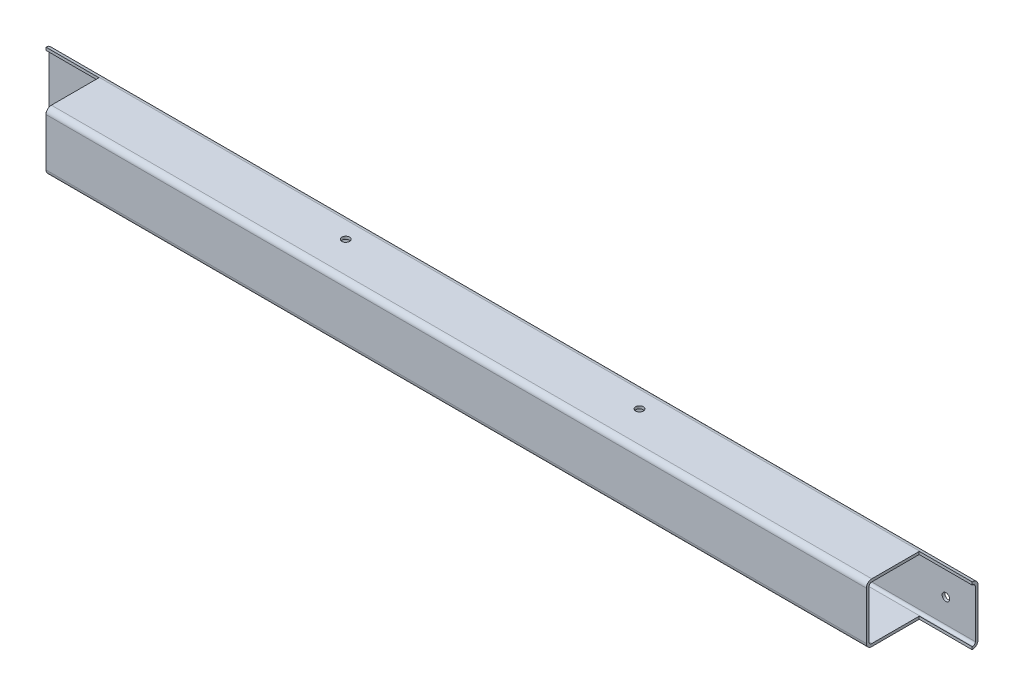
ISO-10303-21;
HEADER;
FILE_DESCRIPTION(('STEP AP214'),'2;1');
FILE_NAME('part.step','',(''),(''),'','','');
FILE_SCHEMA(('AUTOMOTIVE_DESIGN { 1 0 10303 214 1 1 1 1 }'));
ENDSEC;
DATA;
#1=APPLICATION_CONTEXT('core data for automotive mechanical design processes');
#2=APPLICATION_PROTOCOL_DEFINITION('international standard','automotive_design',2000,#1);
#3=PRODUCT_CONTEXT('',#1,'mechanical');
#4=PRODUCT('Part','Part','',(#3));
#5=PRODUCT_RELATED_PRODUCT_CATEGORY('part','',(#4));
#6=PRODUCT_DEFINITION_FORMATION('','',#4);
#7=PRODUCT_DEFINITION_CONTEXT('part definition',#1,'design');
#8=PRODUCT_DEFINITION('design','',#6,#7);
#9=PRODUCT_DEFINITION_SHAPE('','',#8);
#10=(LENGTH_UNIT() NAMED_UNIT(*) SI_UNIT(.MILLI.,.METRE.));
#11=(NAMED_UNIT(*) PLANE_ANGLE_UNIT() SI_UNIT($,.RADIAN.));
#12=(NAMED_UNIT(*) SI_UNIT($,.STERADIAN.) SOLID_ANGLE_UNIT());
#13=UNCERTAINTY_MEASURE_WITH_UNIT(LENGTH_MEASURE(1.E-05),#10,'distance_accuracy_value','');
#14=(GEOMETRIC_REPRESENTATION_CONTEXT(3) GLOBAL_UNCERTAINTY_ASSIGNED_CONTEXT((#13)) GLOBAL_UNIT_ASSIGNED_CONTEXT((#10,
#11,#12)) REPRESENTATION_CONTEXT('',''));
#15=CARTESIAN_POINT('',(0.,0.,0.));
#16=DIRECTION('',(0.,0.,1.));
#17=DIRECTION('',(1.,0.,0.));
#18=AXIS2_PLACEMENT_3D('',#15,#16,#17);
#19=CARTESIAN_POINT('',(394.,-20.3999999999999,20.4));
#20=DIRECTION('',(-1.,0.,0.));
#21=DIRECTION('',(0.,-1.,0.));
#22=AXIS2_PLACEMENT_3D('',#19,#20,#21);
#23=CYLINDRICAL_SURFACE('',#22,2.3);
#24=CARTESIAN_POINT('',(-349.,-20.4,20.4));
#25=DIRECTION('',(1.,0.,0.));
#26=DIRECTION('',(0.,0.,-1.));
#27=AXIS2_PLACEMENT_3D('',#24,#25,#26);
#28=CIRCLE('',#27,2.3);
#29=CARTESIAN_POINT('',(-349.,-20.3999999999999,22.7));
#30=VERTEX_POINT('',#29);
#31=CARTESIAN_POINT('',(-349.,-22.7,20.4));
#32=VERTEX_POINT('',#31);
#33=EDGE_CURVE('E333',#30,#32,#28,.T.);
#34=ORIENTED_EDGE('',*,*,#33,.F.);
#35=DIRECTION('',(-1.,0.,0.));
#36=VECTOR('',#35,1.);
#37=CARTESIAN_POINT('',(394.,-20.3999999999999,22.7));
#38=LINE('',#37,#36);
#39=CARTESIAN_POINT('',(349.,-20.3999999999999,22.7));
#40=VERTEX_POINT('',#39);
#41=EDGE_CURVE('E446',#40,#30,#38,.T.);
#42=ORIENTED_EDGE('',*,*,#41,.F.);
#43=CARTESIAN_POINT('',(349.,-20.3999999999999,20.4));
#44=DIRECTION('',(-1.,0.,0.));
#45=DIRECTION('',(0.,0.,1.));
#46=AXIS2_PLACEMENT_3D('',#43,#44,#45);
#47=CIRCLE('',#46,2.3);
#48=CARTESIAN_POINT('',(349.,-22.6999999999999,20.4));
#49=VERTEX_POINT('',#48);
#50=EDGE_CURVE('E313',#49,#40,#47,.T.);
#51=ORIENTED_EDGE('',*,*,#50,.F.);
#52=DIRECTION('',(-1.,0.,0.));
#53=VECTOR('',#52,1.);
#54=CARTESIAN_POINT('',(394.,-22.6999999999999,20.4));
#55=LINE('',#54,#53);
#56=EDGE_CURVE('E420',#49,#32,#55,.T.);
#57=ORIENTED_EDGE('',*,*,#56,.T.);
#58=EDGE_LOOP('',(#34,#42,#51,#57));
#59=FACE_BOUND('',#58,.T.);
#60=ADVANCED_FACE('F65',(#59),#23,.F.);
#61=CARTESIAN_POINT('',(394.,-20.3999999999999,22.7));
#62=DIRECTION('',(0.,0.,-1.));
#63=DIRECTION('',(-1.,0.,0.));
#64=AXIS2_PLACEMENT_3D('',#61,#62,#63);
#65=PLANE('',#64);
#66=DIRECTION('',(0.,-1.,0.));
#67=VECTOR('',#66,1.);
#68=CARTESIAN_POINT('',(-349.,-20.3999999999999,22.7));
#69=LINE('',#68,#67);
#70=CARTESIAN_POINT('',(-349.,20.4000000000001,22.7));
#71=VERTEX_POINT('',#70);
#72=EDGE_CURVE('E336',#71,#30,#69,.T.);
#73=ORIENTED_EDGE('',*,*,#72,.F.);
#74=DIRECTION('',(-1.,0.,0.));
#75=VECTOR('',#74,1.);
#76=CARTESIAN_POINT('',(394.,20.4000000000001,22.7));
#77=LINE('',#76,#75);
#78=CARTESIAN_POINT('',(349.,20.4000000000001,22.7));
#79=VERTEX_POINT('',#78);
#80=EDGE_CURVE('E442',#79,#71,#77,.T.);
#81=ORIENTED_EDGE('',*,*,#80,.F.);
#82=DIRECTION('',(0.,1.,0.));
#83=VECTOR('',#82,1.);
#84=CARTESIAN_POINT('',(349.,-20.3999999999999,22.7));
#85=LINE('',#84,#83);
#86=EDGE_CURVE('E316',#40,#79,#85,.T.);
#87=ORIENTED_EDGE('',*,*,#86,.F.);
#88=ORIENTED_EDGE('',*,*,#41,.T.);
#89=EDGE_LOOP('',(#73,#81,#87,#88));
#90=FACE_BOUND('',#89,.T.);
#91=ADVANCED_FACE('F573',(#90),#65,.T.);
#92=CARTESIAN_POINT('',(394.,20.4000000000001,20.4));
#93=DIRECTION('',(-1.,0.,0.));
#94=DIRECTION('',(0.,-1.,0.));
#95=AXIS2_PLACEMENT_3D('',#92,#93,#94);
#96=CYLINDRICAL_SURFACE('',#95,2.3);
#97=CARTESIAN_POINT('',(-349.,20.4,20.4));
#98=DIRECTION('',(1.,0.,0.));
#99=DIRECTION('',(0.,0.,-1.));
#100=AXIS2_PLACEMENT_3D('',#97,#98,#99);
#101=CIRCLE('',#100,2.3);
#102=CARTESIAN_POINT('',(-349.,22.7,20.4));
#103=VERTEX_POINT('',#102);
#104=EDGE_CURVE('E339',#103,#71,#101,.T.);
#105=ORIENTED_EDGE('',*,*,#104,.F.);
#106=DIRECTION('',(-1.,0.,0.));
#107=VECTOR('',#106,1.);
#108=CARTESIAN_POINT('',(394.,22.7000000000001,20.4));
#109=LINE('',#108,#107);
#110=CARTESIAN_POINT('',(349.,22.7000000000001,20.4));
#111=VERTEX_POINT('',#110);
#112=EDGE_CURVE('E438',#111,#103,#109,.T.);
#113=ORIENTED_EDGE('',*,*,#112,.F.);
#114=CARTESIAN_POINT('',(349.,20.4000000000001,20.4));
#115=DIRECTION('',(-1.,0.,0.));
#116=DIRECTION('',(0.,0.,1.));
#117=AXIS2_PLACEMENT_3D('',#114,#115,#116);
#118=CIRCLE('',#117,2.3);
#119=EDGE_CURVE('E319',#79,#111,#118,.T.);
#120=ORIENTED_EDGE('',*,*,#119,.F.);
#121=ORIENTED_EDGE('',*,*,#80,.T.);
#122=EDGE_LOOP('',(#105,#113,#120,#121));
#123=FACE_BOUND('',#122,.T.);
#124=ADVANCED_FACE('F568',(#123),#96,.F.);
#125=CARTESIAN_POINT('',(394.,22.7000000000001,-20.4));
#126=DIRECTION('',(0.,-1.,0.));
#127=DIRECTION('',(1.,0.,0.));
#128=AXIS2_PLACEMENT_3D('',#125,#126,#127);
#129=PLANE('',#128);
#130=CARTESIAN_POINT('',(125.,22.7000000000001,-5.99999999999998));
#131=DIRECTION('',(0.,-1.,0.));
#132=DIRECTION('',(1.,0.,0.));
#133=AXIS2_PLACEMENT_3D('',#130,#131,#132);
#134=CIRCLE('',#133,3.25000000000001);
#135=CARTESIAN_POINT('',(128.25,22.7000000000001,-5.99999999999998));
#136=VERTEX_POINT('',#135);
#137=EDGE_CURVE('E515',#136,#136,#134,.T.);
#138=ORIENTED_EDGE('',*,*,#137,.F.);
#139=EDGE_LOOP('',(#138));
#140=FACE_BOUND('',#139,.T.);
#141=CARTESIAN_POINT('',(-125.,22.7000000000001,-5.99999999999998));
#142=DIRECTION('',(0.,-1.,0.));
#143=DIRECTION('',(1.,0.,0.));
#144=AXIS2_PLACEMENT_3D('',#141,#142,#143);
#145=CIRCLE('',#144,3.25000000000001);
#146=CARTESIAN_POINT('',(-121.75,22.7000000000001,-5.99999999999998));
#147=VERTEX_POINT('',#146);
#148=EDGE_CURVE('E508',#147,#147,#145,.T.);
#149=ORIENTED_EDGE('',*,*,#148,.F.);
#150=EDGE_LOOP('',(#149));
#151=FACE_BOUND('',#150,.T.);
#152=DIRECTION('',(1.,0.,0.));
#153=VECTOR('',#152,1.);
#154=CARTESIAN_POINT('',(394.,22.7000000000001,-20.));
#155=LINE('',#154,#153);
#156=CARTESIAN_POINT('',(-394.,22.7,-20.));
#157=VERTEX_POINT('',#156);
#158=CARTESIAN_POINT('',(-349.,22.7,-20.));
#159=VERTEX_POINT('',#158);
#160=EDGE_CURVE('E235',#157,#159,#155,.T.);
#161=ORIENTED_EDGE('',*,*,#160,.F.);
#162=DIRECTION('',(0.,0.,1.));
#163=VECTOR('',#162,1.);
#164=CARTESIAN_POINT('',(-394.,22.7,-20.4));
#165=LINE('',#164,#163);
#166=CARTESIAN_POINT('',(-394.,22.7,-20.4));
#167=VERTEX_POINT('',#166);
#168=EDGE_CURVE('E402',#167,#157,#165,.T.);
#169=ORIENTED_EDGE('',*,*,#168,.F.);
#170=DIRECTION('',(-1.,0.,0.));
#171=VECTOR('',#170,1.);
#172=CARTESIAN_POINT('',(394.,22.7000000000001,-20.4));
#173=LINE('',#172,#171);
#174=CARTESIAN_POINT('',(394.,22.7000000000001,-20.4));
#175=VERTEX_POINT('',#174);
#176=EDGE_CURVE('E435',#175,#167,#173,.T.);
#177=ORIENTED_EDGE('',*,*,#176,.F.);
#178=DIRECTION('',(0.,0.,1.));
#179=VECTOR('',#178,1.);
#180=CARTESIAN_POINT('',(394.,22.7000000000001,-20.4));
#181=LINE('',#180,#179);
#182=CARTESIAN_POINT('',(394.,22.7000000000001,-20.));
#183=VERTEX_POINT('',#182);
#184=EDGE_CURVE('E369',#175,#183,#181,.T.);
#185=ORIENTED_EDGE('',*,*,#184,.T.);
#186=DIRECTION('',(1.,0.,0.));
#187=VECTOR('',#186,1.);
#188=CARTESIAN_POINT('',(394.,22.7000000000001,-20.));
#189=LINE('',#188,#187);
#190=CARTESIAN_POINT('',(349.,22.7000000000001,-20.));
#191=VERTEX_POINT('',#190);
#192=EDGE_CURVE('E310',#191,#183,#189,.T.);
#193=ORIENTED_EDGE('',*,*,#192,.F.);
#194=DIRECTION('',(0.,0.,-1.));
#195=VECTOR('',#194,1.);
#196=CARTESIAN_POINT('',(349.,22.7000000000001,-20.4));
#197=LINE('',#196,#195);
#198=EDGE_CURVE('E322',#111,#191,#197,.T.);
#199=ORIENTED_EDGE('',*,*,#198,.F.);
#200=ORIENTED_EDGE('',*,*,#112,.T.);
#201=DIRECTION('',(0.,0.,1.));
#202=VECTOR('',#201,1.);
#203=CARTESIAN_POINT('',(-349.,22.7,-20.4));
#204=LINE('',#203,#202);
#205=EDGE_CURVE('E342',#159,#103,#204,.T.);
#206=ORIENTED_EDGE('',*,*,#205,.F.);
#207=EDGE_LOOP('',(#161,#169,#177,#185,#193,#199,#200,#206));
#208=FACE_BOUND('',#207,.T.);
#209=ADVANCED_FACE('F562',(#140,#151,#208),#129,.T.);
#210=CARTESIAN_POINT('',(394.,20.4000000000001,-20.4));
#211=DIRECTION('',(-1.,0.,0.));
#212=DIRECTION('',(0.,-1.,0.));
#213=AXIS2_PLACEMENT_3D('',#210,#211,#212);
#214=CYLINDRICAL_SURFACE('',#213,2.3);
#215=CARTESIAN_POINT('',(-394.,20.4,-20.4));
#216=DIRECTION('',(1.,0.,0.));
#217=DIRECTION('',(0.,1.,0.));
#218=AXIS2_PLACEMENT_3D('',#215,#216,#217);
#219=CIRCLE('',#218,2.3);
#220=CARTESIAN_POINT('',(-394.,20.4,-22.7));
#221=VERTEX_POINT('',#220);
#222=EDGE_CURVE('E406',#221,#167,#219,.T.);
#223=ORIENTED_EDGE('',*,*,#222,.F.);
#224=DIRECTION('',(-1.,0.,0.));
#225=VECTOR('',#224,1.);
#226=CARTESIAN_POINT('',(394.,20.4000000000001,-22.7));
#227=LINE('',#226,#225);
#228=CARTESIAN_POINT('',(394.,20.4000000000001,-22.7));
#229=VERTEX_POINT('',#228);
#230=EDGE_CURVE('E432',#229,#221,#227,.T.);
#231=ORIENTED_EDGE('',*,*,#230,.F.);
#232=CARTESIAN_POINT('',(394.,20.4000000000001,-20.4));
#233=DIRECTION('',(1.,0.,0.));
#234=DIRECTION('',(0.,1.,0.));
#235=AXIS2_PLACEMENT_3D('',#232,#233,#234);
#236=CIRCLE('',#235,2.3);
#237=EDGE_CURVE('E373',#229,#175,#236,.T.);
#238=ORIENTED_EDGE('',*,*,#237,.T.);
#239=ORIENTED_EDGE('',*,*,#176,.T.);
#240=EDGE_LOOP('',(#223,#231,#238,#239));
#241=FACE_BOUND('',#240,.T.);
#242=ADVANCED_FACE('F540',(#241),#214,.F.);
#243=CARTESIAN_POINT('',(394.,-20.3999999999999,-22.7));
#244=DIRECTION('',(0.,0.,1.));
#245=DIRECTION('',(1.,0.,0.));
#246=AXIS2_PLACEMENT_3D('',#243,#244,#245);
#247=PLANE('',#246);
#248=CARTESIAN_POINT('',(369.,0.,-22.7));
#249=DIRECTION('',(0.,0.,1.));
#250=DIRECTION('',(1.,0.,0.));
#251=AXIS2_PLACEMENT_3D('',#248,#249,#250);
#252=CIRCLE('',#251,3.24999999999995);
#253=CARTESIAN_POINT('',(372.25,0.,-22.7));
#254=VERTEX_POINT('',#253);
#255=EDGE_CURVE('E283',#254,#254,#252,.T.);
#256=ORIENTED_EDGE('',*,*,#255,.F.);
#257=EDGE_LOOP('',(#256));
#258=FACE_BOUND('',#257,.T.);
#259=CARTESIAN_POINT('',(-369.,1.35568400665612E-13,-22.7));
#260=DIRECTION('',(0.,0.,1.));
#261=DIRECTION('',(1.,0.,0.));
#262=AXIS2_PLACEMENT_3D('',#259,#260,#261);
#263=CIRCLE('',#262,3.24999999999995);
#264=CARTESIAN_POINT('',(-365.75,1.35568400665612E-13,-22.7));
#265=VERTEX_POINT('',#264);
#266=EDGE_CURVE('E524',#265,#265,#263,.T.);
#267=ORIENTED_EDGE('',*,*,#266,.F.);
#268=EDGE_LOOP('',(#267));
#269=FACE_BOUND('',#268,.T.);
#270=DIRECTION('',(0.,1.,0.));
#271=VECTOR('',#270,1.);
#272=CARTESIAN_POINT('',(-394.,-20.4,-22.7));
#273=LINE('',#272,#271);
#274=CARTESIAN_POINT('',(-394.,-20.4,-22.7));
#275=VERTEX_POINT('',#274);
#276=EDGE_CURVE('E410',#275,#221,#273,.T.);
#277=ORIENTED_EDGE('',*,*,#276,.F.);
#278=DIRECTION('',(-1.,0.,0.));
#279=VECTOR('',#278,1.);
#280=CARTESIAN_POINT('',(394.,-20.3999999999999,-22.7));
#281=LINE('',#280,#279);
#282=CARTESIAN_POINT('',(394.,-20.3999999999999,-22.7));
#283=VERTEX_POINT('',#282);
#284=EDGE_CURVE('E429',#283,#275,#281,.T.);
#285=ORIENTED_EDGE('',*,*,#284,.F.);
#286=DIRECTION('',(0.,1.,0.));
#287=VECTOR('',#286,1.);
#288=CARTESIAN_POINT('',(394.,-20.3999999999999,-22.7));
#289=LINE('',#288,#287);
#290=EDGE_CURVE('E377',#283,#229,#289,.T.);
#291=ORIENTED_EDGE('',*,*,#290,.T.);
#292=ORIENTED_EDGE('',*,*,#230,.T.);
#293=EDGE_LOOP('',(#277,#285,#291,#292));
#294=FACE_BOUND('',#293,.T.);
#295=ADVANCED_FACE('F536',(#258,#269,#294),#247,.T.);
#296=CARTESIAN_POINT('',(394.,-20.3999999999999,-20.4));
#297=DIRECTION('',(-1.,0.,0.));
#298=DIRECTION('',(0.,-1.,0.));
#299=AXIS2_PLACEMENT_3D('',#296,#297,#298);
#300=CYLINDRICAL_SURFACE('',#299,2.3);
#301=CARTESIAN_POINT('',(-394.,-20.4,-20.4));
#302=DIRECTION('',(1.,0.,0.));
#303=DIRECTION('',(0.,-1.,0.));
#304=AXIS2_PLACEMENT_3D('',#301,#302,#303);
#305=CIRCLE('',#304,2.3);
#306=CARTESIAN_POINT('',(-394.,-22.7,-20.4));
#307=VERTEX_POINT('',#306);
#308=EDGE_CURVE('E414',#307,#275,#305,.T.);
#309=ORIENTED_EDGE('',*,*,#308,.F.);
#310=DIRECTION('',(-1.,0.,0.));
#311=VECTOR('',#310,1.);
#312=CARTESIAN_POINT('',(394.,-22.6999999999999,-20.4));
#313=LINE('',#312,#311);
#314=CARTESIAN_POINT('',(394.,-22.6999999999999,-20.4));
#315=VERTEX_POINT('',#314);
#316=EDGE_CURVE('E424',#315,#307,#313,.T.);
#317=ORIENTED_EDGE('',*,*,#316,.F.);
#318=CARTESIAN_POINT('',(394.,-20.3999999999999,-20.4));
#319=DIRECTION('',(1.,0.,0.));
#320=DIRECTION('',(0.,-1.,0.));
#321=AXIS2_PLACEMENT_3D('',#318,#319,#320);
#322=CIRCLE('',#321,2.3);
#323=EDGE_CURVE('E381',#315,#283,#322,.T.);
#324=ORIENTED_EDGE('',*,*,#323,.T.);
#325=ORIENTED_EDGE('',*,*,#284,.T.);
#326=EDGE_LOOP('',(#309,#317,#324,#325));
#327=FACE_BOUND('',#326,.T.);
#328=ADVANCED_FACE('F539',(#327),#300,.F.);
#329=CARTESIAN_POINT('',(394.,-20.3999999999999,20.4));
#330=DIRECTION('',(-1.,0.,0.));
#331=DIRECTION('',(0.,-1.,0.));
#332=AXIS2_PLACEMENT_3D('',#329,#330,#331);
#333=CYLINDRICAL_SURFACE('',#332,4.6);
#334=DIRECTION('',(-1.,0.,0.));
#335=VECTOR('',#334,1.);
#336=CARTESIAN_POINT('',(394.,-20.3999999999999,25.));
#337=LINE('',#336,#335);
#338=CARTESIAN_POINT('',(349.,-20.4,25.));
#339=VERTEX_POINT('',#338);
#340=CARTESIAN_POINT('',(-349.,-20.4,25.));
#341=VERTEX_POINT('',#340);
#342=EDGE_CURVE('E388',#339,#341,#337,.T.);
#343=ORIENTED_EDGE('',*,*,#342,.T.);
#344=CARTESIAN_POINT('',(-349.,-20.4,20.4));
#345=DIRECTION('',(1.,0.,0.));
#346=DIRECTION('',(0.,0.,-1.));
#347=AXIS2_PLACEMENT_3D('',#344,#345,#346);
#348=CIRCLE('',#347,4.6);
#349=CARTESIAN_POINT('',(-349.,-25.,20.4));
#350=VERTEX_POINT('',#349);
#351=EDGE_CURVE('E347',#341,#350,#348,.T.);
#352=ORIENTED_EDGE('',*,*,#351,.T.);
#353=DIRECTION('',(-1.,0.,0.));
#354=VECTOR('',#353,1.);
#355=CARTESIAN_POINT('',(394.,-24.9999999999999,20.4));
#356=LINE('',#355,#354);
#357=CARTESIAN_POINT('',(349.,-25.,20.4));
#358=VERTEX_POINT('',#357);
#359=EDGE_CURVE('E425',#358,#350,#356,.T.);
#360=ORIENTED_EDGE('',*,*,#359,.F.);
#361=CARTESIAN_POINT('',(349.,-20.3999999999999,20.4));
#362=DIRECTION('',(-1.,0.,0.));
#363=DIRECTION('',(0.,0.,1.));
#364=AXIS2_PLACEMENT_3D('',#361,#362,#363);
#365=CIRCLE('',#364,4.6);
#366=EDGE_CURVE('E329',#358,#339,#365,.T.);
#367=ORIENTED_EDGE('',*,*,#366,.T.);
#368=EDGE_LOOP('',(#343,#352,#360,#367));
#369=FACE_BOUND('',#368,.T.);
#370=ADVANCED_FACE('F67',(#369),#333,.T.);
#371=CARTESIAN_POINT('',(394.,-24.9999999999999,-20.4));
#372=DIRECTION('',(0.,1.,0.));
#373=DIRECTION('',(-1.,0.,0.));
#374=AXIS2_PLACEMENT_3D('',#371,#372,#373);
#375=PLANE('',#374);
#376=CARTESIAN_POINT('',(-125.,-25.,-5.99999999999998));
#377=DIRECTION('',(0.,-1.,0.));
#378=DIRECTION('',(1.,0.,0.));
#379=AXIS2_PLACEMENT_3D('',#376,#377,#378);
#380=CIRCLE('',#379,7.50000000000001);
#381=CARTESIAN_POINT('',(-117.5,-25.,-5.99999999999998));
#382=VERTEX_POINT('',#381);
#383=EDGE_CURVE('E488',#382,#382,#380,.T.);
#384=ORIENTED_EDGE('',*,*,#383,.F.);
#385=EDGE_LOOP('',(#384));
#386=FACE_BOUND('',#385,.T.);
#387=CARTESIAN_POINT('',(125.,-24.9999999999999,-5.99999999999998));
#388=DIRECTION('',(0.,-1.,0.));
#389=DIRECTION('',(1.,0.,0.));
#390=AXIS2_PLACEMENT_3D('',#387,#388,#389);
#391=CIRCLE('',#390,7.50000000000001);
#392=CARTESIAN_POINT('',(132.5,-24.9999999999999,-5.99999999999998));
#393=VERTEX_POINT('',#392);
#394=EDGE_CURVE('E496',#393,#393,#391,.T.);
#395=ORIENTED_EDGE('',*,*,#394,.F.);
#396=EDGE_LOOP('',(#395));
#397=FACE_BOUND('',#396,.T.);
#398=DIRECTION('',(0.,0.,-1.));
#399=VECTOR('',#398,1.);
#400=CARTESIAN_POINT('',(-349.,-25.,25.));
#401=LINE('',#400,#399);
#402=CARTESIAN_POINT('',(-349.,-25.,-20.));
#403=VERTEX_POINT('',#402);
#404=EDGE_CURVE('E259',#350,#403,#401,.T.);
#405=ORIENTED_EDGE('',*,*,#404,.T.);
#406=DIRECTION('',(-1.,0.,0.));
#407=VECTOR('',#406,1.);
#408=CARTESIAN_POINT('',(-394.,-25.,-20.));
#409=LINE('',#408,#407);
#410=CARTESIAN_POINT('',(-394.,-25.,-20.));
#411=VERTEX_POINT('',#410);
#412=EDGE_CURVE('E265',#403,#411,#409,.T.);
#413=ORIENTED_EDGE('',*,*,#412,.T.);
#414=DIRECTION('',(0.,0.,-1.));
#415=VECTOR('',#414,1.);
#416=CARTESIAN_POINT('',(-394.,-25.,-20.4));
#417=LINE('',#416,#415);
#418=CARTESIAN_POINT('',(-394.,-25.,-20.4));
#419=VERTEX_POINT('',#418);
#420=EDGE_CURVE('E351',#411,#419,#417,.T.);
#421=ORIENTED_EDGE('',*,*,#420,.T.);
#422=DIRECTION('',(-1.,0.,0.));
#423=VECTOR('',#422,1.);
#424=CARTESIAN_POINT('',(394.,-24.9999999999999,-20.4));
#425=LINE('',#424,#423);
#426=CARTESIAN_POINT('',(394.,-24.9999999999999,-20.4));
#427=VERTEX_POINT('',#426);
#428=EDGE_CURVE('E472',#427,#419,#425,.T.);
#429=ORIENTED_EDGE('',*,*,#428,.F.);
#430=DIRECTION('',(0.,0.,-1.));
#431=VECTOR('',#430,1.);
#432=CARTESIAN_POINT('',(394.,-24.9999999999999,-20.4));
#433=LINE('',#432,#431);
#434=CARTESIAN_POINT('',(394.,-24.9999999999999,-20.));
#435=VERTEX_POINT('',#434);
#436=EDGE_CURVE('E352',#435,#427,#433,.T.);
#437=ORIENTED_EDGE('',*,*,#436,.F.);
#438=DIRECTION('',(-1.,0.,0.));
#439=VECTOR('',#438,1.);
#440=CARTESIAN_POINT('',(394.,-25.,-20.));
#441=LINE('',#440,#439);
#442=CARTESIAN_POINT('',(349.,-25.,-20.));
#443=VERTEX_POINT('',#442);
#444=EDGE_CURVE('E83',#435,#443,#441,.T.);
#445=ORIENTED_EDGE('',*,*,#444,.T.);
#446=DIRECTION('',(0.,0.,1.));
#447=VECTOR('',#446,1.);
#448=CARTESIAN_POINT('',(349.,-25.,25.));
#449=LINE('',#448,#447);
#450=EDGE_CURVE('E288',#443,#358,#449,.T.);
#451=ORIENTED_EDGE('',*,*,#450,.T.);
#452=ORIENTED_EDGE('',*,*,#359,.T.);
#453=EDGE_LOOP('',(#405,#413,#421,#429,#437,#445,#451,#452));
#454=FACE_BOUND('',#453,.T.);
#455=ADVANCED_FACE('F588',(#386,#397,#454),#375,.F.);
#456=CARTESIAN_POINT('',(394.,-20.3999999999999,-20.4));
#457=DIRECTION('',(-1.,0.,0.));
#458=DIRECTION('',(0.,-1.,0.));
#459=AXIS2_PLACEMENT_3D('',#456,#457,#458);
#460=CYLINDRICAL_SURFACE('',#459,4.6);
#461=CARTESIAN_POINT('',(-394.,-20.4,-20.4));
#462=DIRECTION('',(1.,0.,0.));
#463=DIRECTION('',(0.,-1.,0.));
#464=AXIS2_PLACEMENT_3D('',#461,#462,#463);
#465=CIRCLE('',#464,4.6);
#466=CARTESIAN_POINT('',(-394.,-20.4,-25.));
#467=VERTEX_POINT('',#466);
#468=EDGE_CURVE('E391',#419,#467,#465,.T.);
#469=ORIENTED_EDGE('',*,*,#468,.T.);
#470=DIRECTION('',(-1.,0.,0.));
#471=VECTOR('',#470,1.);
#472=CARTESIAN_POINT('',(394.,-20.3999999999999,-25.));
#473=LINE('',#472,#471);
#474=CARTESIAN_POINT('',(394.,-20.3999999999999,-25.));
#475=VERTEX_POINT('',#474);
#476=EDGE_CURVE('E468',#475,#467,#473,.T.);
#477=ORIENTED_EDGE('',*,*,#476,.F.);
#478=CARTESIAN_POINT('',(394.,-20.3999999999999,-20.4));
#479=DIRECTION('',(1.,0.,0.));
#480=DIRECTION('',(0.,-1.,0.));
#481=AXIS2_PLACEMENT_3D('',#478,#479,#480);
#482=CIRCLE('',#481,4.6);
#483=EDGE_CURVE('E355',#427,#475,#482,.T.);
#484=ORIENTED_EDGE('',*,*,#483,.F.);
#485=ORIENTED_EDGE('',*,*,#428,.T.);
#486=EDGE_LOOP('',(#469,#477,#484,#485));
#487=FACE_BOUND('',#486,.T.);
#488=ADVANCED_FACE('F623',(#487),#460,.T.);
#489=CARTESIAN_POINT('',(394.,-20.3999999999999,-25.));
#490=DIRECTION('',(0.,0.,1.));
#491=DIRECTION('',(1.,0.,0.));
#492=AXIS2_PLACEMENT_3D('',#489,#490,#491);
#493=PLANE('',#492);
#494=CARTESIAN_POINT('',(369.,0.,-25.));
#495=DIRECTION('',(0.,0.,-1.));
#496=DIRECTION('',(-1.,0.,0.));
#497=AXIS2_PLACEMENT_3D('',#494,#495,#496);
#498=CIRCLE('',#497,3.24999999999995);
#499=CARTESIAN_POINT('',(365.75,0.,-25.));
#500=VERTEX_POINT('',#499);
#501=EDGE_CURVE('E520',#500,#500,#498,.T.);
#502=ORIENTED_EDGE('',*,*,#501,.F.);
#503=EDGE_LOOP('',(#502));
#504=FACE_BOUND('',#503,.T.);
#505=CARTESIAN_POINT('',(-369.,1.35568400665612E-13,-25.));
#506=DIRECTION('',(0.,0.,-1.));
#507=DIRECTION('',(-1.,0.,0.));
#508=AXIS2_PLACEMENT_3D('',#505,#506,#507);
#509=CIRCLE('',#508,3.24999999999995);
#510=CARTESIAN_POINT('',(-372.25,1.35568400665612E-13,-25.));
#511=VERTEX_POINT('',#510);
#512=EDGE_CURVE('E519',#511,#511,#509,.T.);
#513=ORIENTED_EDGE('',*,*,#512,.F.);
#514=EDGE_LOOP('',(#513));
#515=FACE_BOUND('',#514,.T.);
#516=DIRECTION('',(0.,1.,0.));
#517=VECTOR('',#516,1.);
#518=CARTESIAN_POINT('',(-394.,-20.4,-25.));
#519=LINE('',#518,#517);
#520=CARTESIAN_POINT('',(-394.,20.4,-25.));
#521=VERTEX_POINT('',#520);
#522=EDGE_CURVE('E394',#467,#521,#519,.T.);
#523=ORIENTED_EDGE('',*,*,#522,.T.);
#524=DIRECTION('',(-1.,0.,0.));
#525=VECTOR('',#524,1.);
#526=CARTESIAN_POINT('',(394.,20.4000000000001,-25.));
#527=LINE('',#526,#525);
#528=CARTESIAN_POINT('',(394.,20.4000000000001,-25.));
#529=VERTEX_POINT('',#528);
#530=EDGE_CURVE('E464',#529,#521,#527,.T.);
#531=ORIENTED_EDGE('',*,*,#530,.F.);
#532=DIRECTION('',(0.,1.,0.));
#533=VECTOR('',#532,1.);
#534=CARTESIAN_POINT('',(394.,-20.3999999999999,-25.));
#535=LINE('',#534,#533);
#536=EDGE_CURVE('E359',#475,#529,#535,.T.);
#537=ORIENTED_EDGE('',*,*,#536,.F.);
#538=ORIENTED_EDGE('',*,*,#476,.T.);
#539=EDGE_LOOP('',(#523,#531,#537,#538));
#540=FACE_BOUND('',#539,.T.);
#541=ADVANCED_FACE('F619',(#504,#515,#540),#493,.F.);
#542=CARTESIAN_POINT('',(394.,20.4000000000001,-20.4));
#543=DIRECTION('',(-1.,0.,0.));
#544=DIRECTION('',(0.,-1.,0.));
#545=AXIS2_PLACEMENT_3D('',#542,#543,#544);
#546=CYLINDRICAL_SURFACE('',#545,4.6);
#547=CARTESIAN_POINT('',(-394.,20.4,-20.4));
#548=DIRECTION('',(1.,0.,0.));
#549=DIRECTION('',(0.,1.,0.));
#550=AXIS2_PLACEMENT_3D('',#547,#548,#549);
#551=CIRCLE('',#550,4.6);
#552=CARTESIAN_POINT('',(-394.,25.,-20.4));
#553=VERTEX_POINT('',#552);
#554=EDGE_CURVE('E397',#521,#553,#551,.T.);
#555=ORIENTED_EDGE('',*,*,#554,.T.);
#556=DIRECTION('',(-1.,0.,0.));
#557=VECTOR('',#556,1.);
#558=CARTESIAN_POINT('',(394.,25.0000000000001,-20.4));
#559=LINE('',#558,#557);
#560=CARTESIAN_POINT('',(394.,25.0000000000001,-20.4));
#561=VERTEX_POINT('',#560);
#562=EDGE_CURVE('E461',#561,#553,#559,.T.);
#563=ORIENTED_EDGE('',*,*,#562,.F.);
#564=CARTESIAN_POINT('',(394.,20.4000000000001,-20.4));
#565=DIRECTION('',(1.,0.,0.));
#566=DIRECTION('',(0.,1.,0.));
#567=AXIS2_PLACEMENT_3D('',#564,#565,#566);
#568=CIRCLE('',#567,4.6);
#569=EDGE_CURVE('E362',#529,#561,#568,.T.);
#570=ORIENTED_EDGE('',*,*,#569,.F.);
#571=ORIENTED_EDGE('',*,*,#530,.T.);
#572=EDGE_LOOP('',(#555,#563,#570,#571));
#573=FACE_BOUND('',#572,.T.);
#574=ADVANCED_FACE('F615',(#573),#546,.T.);
#575=CARTESIAN_POINT('',(394.,25.0000000000001,-20.4));
#576=DIRECTION('',(0.,-1.,0.));
#577=DIRECTION('',(1.,0.,0.));
#578=AXIS2_PLACEMENT_3D('',#575,#576,#577);
#579=PLANE('',#578);
#580=CARTESIAN_POINT('',(125.,25.0000000000001,-5.99999999999998));
#581=DIRECTION('',(0.,1.,0.));
#582=DIRECTION('',(-1.,0.,0.));
#583=AXIS2_PLACEMENT_3D('',#580,#581,#582);
#584=CIRCLE('',#583,3.25000000000001);
#585=CARTESIAN_POINT('',(121.75,25.0000000000001,-5.99999999999998));
#586=VERTEX_POINT('',#585);
#587=EDGE_CURVE('E504',#586,#586,#584,.T.);
#588=ORIENTED_EDGE('',*,*,#587,.F.);
#589=EDGE_LOOP('',(#588));
#590=FACE_BOUND('',#589,.T.);
#591=CARTESIAN_POINT('',(-125.,25.,-5.99999999999998));
#592=DIRECTION('',(0.,1.,0.));
#593=DIRECTION('',(-1.,0.,0.));
#594=AXIS2_PLACEMENT_3D('',#591,#592,#593);
#595=CIRCLE('',#594,3.25000000000001);
#596=CARTESIAN_POINT('',(-128.25,25.,-5.99999999999998));
#597=VERTEX_POINT('',#596);
#598=EDGE_CURVE('E493',#597,#597,#595,.T.);
#599=ORIENTED_EDGE('',*,*,#598,.F.);
#600=EDGE_LOOP('',(#599));
#601=FACE_BOUND('',#600,.T.);
#602=DIRECTION('',(0.,0.,1.));
#603=VECTOR('',#602,1.);
#604=CARTESIAN_POINT('',(-394.,25.,-20.4));
#605=LINE('',#604,#603);
#606=CARTESIAN_POINT('',(-394.,25.0000000000001,-20.));
#607=VERTEX_POINT('',#606);
#608=EDGE_CURVE('E257',#553,#607,#605,.T.);
#609=ORIENTED_EDGE('',*,*,#608,.T.);
#610=DIRECTION('',(-1.,0.,0.));
#611=VECTOR('',#610,1.);
#612=CARTESIAN_POINT('',(-394.,25.0000000000001,-20.));
#613=LINE('',#612,#611);
#614=CARTESIAN_POINT('',(-349.,25.0000000000001,-20.));
#615=VERTEX_POINT('',#614);
#616=EDGE_CURVE('E232',#615,#607,#613,.T.);
#617=ORIENTED_EDGE('',*,*,#616,.F.);
#618=DIRECTION('',(0.,0.,-1.));
#619=VECTOR('',#618,1.);
#620=CARTESIAN_POINT('',(-349.,25.0000000000001,25.));
#621=LINE('',#620,#619);
#622=CARTESIAN_POINT('',(-349.,25.0000000000001,20.4));
#623=VERTEX_POINT('',#622);
#624=EDGE_CURVE('E243',#623,#615,#621,.T.);
#625=ORIENTED_EDGE('',*,*,#624,.F.);
#626=DIRECTION('',(-1.,0.,0.));
#627=VECTOR('',#626,1.);
#628=CARTESIAN_POINT('',(394.,25.0000000000001,20.4));
#629=LINE('',#628,#627);
#630=CARTESIAN_POINT('',(349.,25.0000000000001,20.4));
#631=VERTEX_POINT('',#630);
#632=EDGE_CURVE('E458',#631,#623,#629,.T.);
#633=ORIENTED_EDGE('',*,*,#632,.F.);
#634=DIRECTION('',(0.,0.,1.));
#635=VECTOR('',#634,1.);
#636=CARTESIAN_POINT('',(349.,25.0000000000001,25.));
#637=LINE('',#636,#635);
#638=CARTESIAN_POINT('',(349.,25.0000000000001,-20.));
#639=VERTEX_POINT('',#638);
#640=EDGE_CURVE('E282',#639,#631,#637,.T.);
#641=ORIENTED_EDGE('',*,*,#640,.F.);
#642=DIRECTION('',(-1.,0.,0.));
#643=VECTOR('',#642,1.);
#644=CARTESIAN_POINT('',(394.,25.0000000000001,-20.));
#645=LINE('',#644,#643);
#646=CARTESIAN_POINT('',(394.,25.0000000000001,-20.));
#647=VERTEX_POINT('',#646);
#648=EDGE_CURVE('E278',#647,#639,#645,.T.);
#649=ORIENTED_EDGE('',*,*,#648,.F.);
#650=DIRECTION('',(0.,0.,1.));
#651=VECTOR('',#650,1.);
#652=CARTESIAN_POINT('',(394.,25.0000000000001,-20.4));
#653=LINE('',#652,#651);
#654=EDGE_CURVE('E365',#561,#647,#653,.T.);
#655=ORIENTED_EDGE('',*,*,#654,.F.);
#656=ORIENTED_EDGE('',*,*,#562,.T.);
#657=EDGE_LOOP('',(#609,#617,#625,#633,#641,#649,#655,#656));
#658=FACE_BOUND('',#657,.T.);
#659=ADVANCED_FACE('F254',(#590,#601,#658),#579,.F.);
#660=CARTESIAN_POINT('',(394.,20.4000000000001,20.4));
#661=DIRECTION('',(-1.,0.,0.));
#662=DIRECTION('',(0.,-1.,0.));
#663=AXIS2_PLACEMENT_3D('',#660,#661,#662);
#664=CYLINDRICAL_SURFACE('',#663,4.6);
#665=ORIENTED_EDGE('',*,*,#632,.T.);
#666=CARTESIAN_POINT('',(-349.,20.4,20.4));
#667=DIRECTION('',(1.,0.,0.));
#668=DIRECTION('',(0.,0.,-1.));
#669=AXIS2_PLACEMENT_3D('',#666,#667,#668);
#670=CIRCLE('',#669,4.6);
#671=CARTESIAN_POINT('',(-349.,20.4000000000001,25.));
#672=VERTEX_POINT('',#671);
#673=EDGE_CURVE('E246',#623,#672,#670,.T.);
#674=ORIENTED_EDGE('',*,*,#673,.T.);
#675=DIRECTION('',(-1.,0.,0.));
#676=VECTOR('',#675,1.);
#677=CARTESIAN_POINT('',(394.,20.4000000000001,25.));
#678=LINE('',#677,#676);
#679=CARTESIAN_POINT('',(349.,20.4000000000001,25.));
#680=VERTEX_POINT('',#679);
#681=EDGE_CURVE('E454',#680,#672,#678,.T.);
#682=ORIENTED_EDGE('',*,*,#681,.F.);
#683=CARTESIAN_POINT('',(349.,20.4000000000001,20.4));
#684=DIRECTION('',(-1.,0.,0.));
#685=DIRECTION('',(0.,0.,1.));
#686=AXIS2_PLACEMENT_3D('',#683,#684,#685);
#687=CIRCLE('',#686,4.6);
#688=EDGE_CURVE('E325',#680,#631,#687,.T.);
#689=ORIENTED_EDGE('',*,*,#688,.T.);
#690=EDGE_LOOP('',(#665,#674,#682,#689));
#691=FACE_BOUND('',#690,.T.);
#692=ADVANCED_FACE('F597',(#691),#664,.T.);
#693=CARTESIAN_POINT('',(394.,-20.3999999999999,25.));
#694=DIRECTION('',(0.,0.,-1.));
#695=DIRECTION('',(-1.,0.,0.));
#696=AXIS2_PLACEMENT_3D('',#693,#694,#695);
#697=PLANE('',#696);
#698=ORIENTED_EDGE('',*,*,#681,.T.);
#699=DIRECTION('',(0.,1.,0.));
#700=VECTOR('',#699,1.);
#701=CARTESIAN_POINT('',(-349.,-25.,25.));
#702=LINE('',#701,#700);
#703=EDGE_CURVE('E240',#341,#672,#702,.T.);
#704=ORIENTED_EDGE('',*,*,#703,.F.);
#705=ORIENTED_EDGE('',*,*,#342,.F.);
#706=DIRECTION('',(0.,1.,0.));
#707=VECTOR('',#706,1.);
#708=CARTESIAN_POINT('',(349.,-25.,25.));
#709=LINE('',#708,#707);
#710=EDGE_CURVE('E251',#339,#680,#709,.T.);
#711=ORIENTED_EDGE('',*,*,#710,.T.);
#712=EDGE_LOOP('',(#698,#704,#705,#711));
#713=FACE_BOUND('',#712,.T.);
#714=ADVANCED_FACE('F594',(#713),#697,.F.);
#715=CARTESIAN_POINT('',(394.,-22.6999999999999,-20.4));
#716=DIRECTION('',(0.,1.,0.));
#717=DIRECTION('',(-1.,0.,0.));
#718=AXIS2_PLACEMENT_3D('',#715,#716,#717);
#719=PLANE('',#718);
#720=CARTESIAN_POINT('',(-125.,-22.6999999999999,-5.99999999999998));
#721=DIRECTION('',(0.,1.,0.));
#722=DIRECTION('',(-1.,0.,0.));
#723=AXIS2_PLACEMENT_3D('',#720,#721,#722);
#724=CIRCLE('',#723,7.50000000000001);
#725=CARTESIAN_POINT('',(-132.5,-22.6999999999999,-5.99999999999998));
#726=VERTEX_POINT('',#725);
#727=EDGE_CURVE('E69',#726,#726,#724,.T.);
#728=ORIENTED_EDGE('',*,*,#727,.F.);
#729=EDGE_LOOP('',(#728));
#730=FACE_BOUND('',#729,.T.);
#731=CARTESIAN_POINT('',(125.,-22.6999999999999,-5.99999999999998));
#732=DIRECTION('',(0.,1.,0.));
#733=DIRECTION('',(-1.,0.,0.));
#734=AXIS2_PLACEMENT_3D('',#731,#732,#733);
#735=CIRCLE('',#734,7.50000000000001);
#736=CARTESIAN_POINT('',(117.5,-22.6999999999999,-5.99999999999998));
#737=VERTEX_POINT('',#736);
#738=EDGE_CURVE('E486',#737,#737,#735,.T.);
#739=ORIENTED_EDGE('',*,*,#738,.F.);
#740=EDGE_LOOP('',(#739));
#741=FACE_BOUND('',#740,.T.);
#742=DIRECTION('',(-1.,0.,0.));
#743=VECTOR('',#742,1.);
#744=CARTESIAN_POINT('',(394.,-22.6999999999999,-20.));
#745=LINE('',#744,#743);
#746=CARTESIAN_POINT('',(-349.,-22.7,-20.));
#747=VERTEX_POINT('',#746);
#748=CARTESIAN_POINT('',(-394.,-22.7,-20.));
#749=VERTEX_POINT('',#748);
#750=EDGE_CURVE('E91',#747,#749,#745,.T.);
#751=ORIENTED_EDGE('',*,*,#750,.F.);
#752=DIRECTION('',(0.,0.,-1.));
#753=VECTOR('',#752,1.);
#754=CARTESIAN_POINT('',(-349.,-22.7,-20.4));
#755=LINE('',#754,#753);
#756=EDGE_CURVE('E12',#32,#747,#755,.T.);
#757=ORIENTED_EDGE('',*,*,#756,.F.);
#758=ORIENTED_EDGE('',*,*,#56,.F.);
#759=DIRECTION('',(0.,0.,1.));
#760=VECTOR('',#759,1.);
#761=CARTESIAN_POINT('',(349.,-22.6999999999999,-20.4));
#762=LINE('',#761,#760);
#763=CARTESIAN_POINT('',(349.,-22.6999999999999,-20.));
#764=VERTEX_POINT('',#763);
#765=EDGE_CURVE('E75',#764,#49,#762,.T.);
#766=ORIENTED_EDGE('',*,*,#765,.F.);
#767=DIRECTION('',(-1.,0.,0.));
#768=VECTOR('',#767,1.);
#769=CARTESIAN_POINT('',(394.,-22.6999999999999,-20.));
#770=LINE('',#769,#768);
#771=CARTESIAN_POINT('',(394.,-22.6999999999999,-20.));
#772=VERTEX_POINT('',#771);
#773=EDGE_CURVE('E307',#772,#764,#770,.T.);
#774=ORIENTED_EDGE('',*,*,#773,.F.);
#775=DIRECTION('',(0.,0.,-1.));
#776=VECTOR('',#775,1.);
#777=CARTESIAN_POINT('',(394.,-22.6999999999999,-20.4));
#778=LINE('',#777,#776);
#779=EDGE_CURVE('E385',#772,#315,#778,.T.);
#780=ORIENTED_EDGE('',*,*,#779,.T.);
#781=ORIENTED_EDGE('',*,*,#316,.T.);
#782=DIRECTION('',(0.,0.,-1.));
#783=VECTOR('',#782,1.);
#784=CARTESIAN_POINT('',(-394.,-22.7,-20.4));
#785=LINE('',#784,#783);
#786=EDGE_CURVE('E356',#749,#307,#785,.T.);
#787=ORIENTED_EDGE('',*,*,#786,.F.);
#788=EDGE_LOOP('',(#751,#757,#758,#766,#774,#780,#781,#787));
#789=FACE_BOUND('',#788,.T.);
#790=ADVANCED_FACE('F582',(#730,#741,#789),#719,.T.);
#791=CARTESIAN_POINT('',(394.,-20.3999999999999,20.4));
#792=DIRECTION('',(-1.,0.,0.));
#793=DIRECTION('',(0.,-1.,0.));
#794=AXIS2_PLACEMENT_3D('',#791,#792,#793);
#795=PLANE('',#794);
#796=ORIENTED_EDGE('',*,*,#654,.T.);
#797=DIRECTION('',(0.,-1.,0.));
#798=VECTOR('',#797,1.);
#799=CARTESIAN_POINT('',(394.,-20.3999999999999,-20.));
#800=LINE('',#799,#798);
#801=EDGE_CURVE('E481',#647,#183,#800,.T.);
#802=ORIENTED_EDGE('',*,*,#801,.T.);
#803=ORIENTED_EDGE('',*,*,#184,.F.);
#804=ORIENTED_EDGE('',*,*,#237,.F.);
#805=ORIENTED_EDGE('',*,*,#290,.F.);
#806=ORIENTED_EDGE('',*,*,#323,.F.);
#807=ORIENTED_EDGE('',*,*,#779,.F.);
#808=DIRECTION('',(0.,1.,0.));
#809=VECTOR('',#808,1.);
#810=CARTESIAN_POINT('',(394.,-25.,-20.));
#811=LINE('',#810,#809);
#812=EDGE_CURVE('E292',#435,#772,#811,.T.);
#813=ORIENTED_EDGE('',*,*,#812,.F.);
#814=ORIENTED_EDGE('',*,*,#436,.T.);
#815=ORIENTED_EDGE('',*,*,#483,.T.);
#816=ORIENTED_EDGE('',*,*,#536,.T.);
#817=ORIENTED_EDGE('',*,*,#569,.T.);
#818=EDGE_LOOP('',(#796,#802,#803,#804,#805,#806,#807,#813,#814,#815,#816,#817));
#819=FACE_BOUND('',#818,.T.);
#820=ADVANCED_FACE('F556',(#819),#795,.F.);
#821=CARTESIAN_POINT('',(-394.,-20.4,20.4));
#822=DIRECTION('',(-1.,0.,0.));
#823=DIRECTION('',(0.,-1.,0.));
#824=AXIS2_PLACEMENT_3D('',#821,#822,#823);
#825=PLANE('',#824);
#826=DIRECTION('',(0.,-1.,0.));
#827=VECTOR('',#826,1.);
#828=CARTESIAN_POINT('',(-394.,-20.4,-20.));
#829=LINE('',#828,#827);
#830=EDGE_CURVE('E450',#607,#157,#829,.T.);
#831=ORIENTED_EDGE('',*,*,#830,.F.);
#832=ORIENTED_EDGE('',*,*,#608,.F.);
#833=ORIENTED_EDGE('',*,*,#554,.F.);
#834=ORIENTED_EDGE('',*,*,#522,.F.);
#835=ORIENTED_EDGE('',*,*,#468,.F.);
#836=ORIENTED_EDGE('',*,*,#420,.F.);
#837=DIRECTION('',(0.,1.,0.));
#838=VECTOR('',#837,1.);
#839=CARTESIAN_POINT('',(-394.,-25.,-20.));
#840=LINE('',#839,#838);
#841=EDGE_CURVE('E272',#411,#749,#840,.T.);
#842=ORIENTED_EDGE('',*,*,#841,.T.);
#843=ORIENTED_EDGE('',*,*,#786,.T.);
#844=ORIENTED_EDGE('',*,*,#308,.T.);
#845=ORIENTED_EDGE('',*,*,#276,.T.);
#846=ORIENTED_EDGE('',*,*,#222,.T.);
#847=ORIENTED_EDGE('',*,*,#168,.T.);
#848=EDGE_LOOP('',(#831,#832,#833,#834,#835,#836,#842,#843,#844,#845,#846,#847));
#849=FACE_BOUND('',#848,.T.);
#850=ADVANCED_FACE('F549',(#849),#825,.T.);
#851=CARTESIAN_POINT('',(-349.,-25.,25.));
#852=DIRECTION('',(1.,0.,0.));
#853=DIRECTION('',(0.,0.,-1.));
#854=AXIS2_PLACEMENT_3D('',#851,#852,#853);
#855=PLANE('',#854);
#856=ORIENTED_EDGE('',*,*,#703,.T.);
#857=ORIENTED_EDGE('',*,*,#673,.F.);
#858=ORIENTED_EDGE('',*,*,#624,.T.);
#859=DIRECTION('',(0.,1.,0.));
#860=VECTOR('',#859,1.);
#861=CARTESIAN_POINT('',(-349.,-25.,-20.));
#862=LINE('',#861,#860);
#863=EDGE_CURVE('E228',#159,#615,#862,.T.);
#864=ORIENTED_EDGE('',*,*,#863,.F.);
#865=ORIENTED_EDGE('',*,*,#205,.T.);
#866=ORIENTED_EDGE('',*,*,#104,.T.);
#867=ORIENTED_EDGE('',*,*,#72,.T.);
#868=ORIENTED_EDGE('',*,*,#33,.T.);
#869=ORIENTED_EDGE('',*,*,#756,.T.);
#870=EDGE_CURVE('E239',#403,#747,#862,.T.);
#871=ORIENTED_EDGE('',*,*,#870,.F.);
#872=ORIENTED_EDGE('',*,*,#404,.F.);
#873=ORIENTED_EDGE('',*,*,#351,.F.);
#874=EDGE_LOOP('',(#856,#857,#858,#864,#865,#866,#867,#868,#869,#871,#872,#873));
#875=FACE_BOUND('',#874,.T.);
#876=ADVANCED_FACE('F244',(#875),#855,.F.);
#877=CARTESIAN_POINT('',(-394.,-25.,-20.));
#878=DIRECTION('',(0.,0.,-1.));
#879=DIRECTION('',(-1.,0.,0.));
#880=AXIS2_PLACEMENT_3D('',#877,#878,#879);
#881=PLANE('',#880);
#882=ORIENTED_EDGE('',*,*,#160,.T.);
#883=ORIENTED_EDGE('',*,*,#863,.T.);
#884=ORIENTED_EDGE('',*,*,#616,.T.);
#885=ORIENTED_EDGE('',*,*,#830,.T.);
#886=EDGE_LOOP('',(#882,#883,#884,#885));
#887=FACE_BOUND('',#886,.T.);
#888=ADVANCED_FACE('F230',(#887),#881,.F.);
#889=ORIENTED_EDGE('',*,*,#750,.T.);
#890=ORIENTED_EDGE('',*,*,#841,.F.);
#891=ORIENTED_EDGE('',*,*,#412,.F.);
#892=ORIENTED_EDGE('',*,*,#870,.T.);
#893=EDGE_LOOP('',(#889,#890,#891,#892));
#894=FACE_BOUND('',#893,.T.);
#895=ADVANCED_FACE('F585',(#894),#881,.F.);
#896=CARTESIAN_POINT('',(349.,-25.,25.));
#897=DIRECTION('',(-1.,0.,0.));
#898=DIRECTION('',(0.,0.,1.));
#899=AXIS2_PLACEMENT_3D('',#896,#897,#898);
#900=PLANE('',#899);
#901=ORIENTED_EDGE('',*,*,#450,.F.);
#902=DIRECTION('',(0.,1.,0.));
#903=VECTOR('',#902,1.);
#904=CARTESIAN_POINT('',(349.,-25.,-20.));
#905=LINE('',#904,#903);
#906=EDGE_CURVE('E296',#443,#764,#905,.T.);
#907=ORIENTED_EDGE('',*,*,#906,.T.);
#908=ORIENTED_EDGE('',*,*,#765,.T.);
#909=ORIENTED_EDGE('',*,*,#50,.T.);
#910=ORIENTED_EDGE('',*,*,#86,.T.);
#911=ORIENTED_EDGE('',*,*,#119,.T.);
#912=ORIENTED_EDGE('',*,*,#198,.T.);
#913=EDGE_CURVE('E300',#191,#639,#905,.T.);
#914=ORIENTED_EDGE('',*,*,#913,.T.);
#915=ORIENTED_EDGE('',*,*,#640,.T.);
#916=ORIENTED_EDGE('',*,*,#688,.F.);
#917=ORIENTED_EDGE('',*,*,#710,.F.);
#918=ORIENTED_EDGE('',*,*,#366,.F.);
#919=EDGE_LOOP('',(#901,#907,#908,#909,#910,#911,#912,#914,#915,#916,#917,#918));
#920=FACE_BOUND('',#919,.T.);
#921=ADVANCED_FACE('F603',(#920),#900,.F.);
#922=CARTESIAN_POINT('',(394.,-25.,-20.));
#923=DIRECTION('',(0.,0.,-1.));
#924=DIRECTION('',(-1.,0.,0.));
#925=AXIS2_PLACEMENT_3D('',#922,#923,#924);
#926=PLANE('',#925);
#927=ORIENTED_EDGE('',*,*,#192,.T.);
#928=ORIENTED_EDGE('',*,*,#801,.F.);
#929=ORIENTED_EDGE('',*,*,#648,.T.);
#930=ORIENTED_EDGE('',*,*,#913,.F.);
#931=EDGE_LOOP('',(#927,#928,#929,#930));
#932=FACE_BOUND('',#931,.T.);
#933=ADVANCED_FACE('F608',(#932),#926,.F.);
#934=ORIENTED_EDGE('',*,*,#773,.T.);
#935=ORIENTED_EDGE('',*,*,#906,.F.);
#936=ORIENTED_EDGE('',*,*,#444,.F.);
#937=ORIENTED_EDGE('',*,*,#812,.T.);
#938=EDGE_LOOP('',(#934,#935,#936,#937));
#939=FACE_BOUND('',#938,.T.);
#940=ADVANCED_FACE('F626',(#939),#926,.F.);
#941=CARTESIAN_POINT('',(-369.,1.35568400665612E-13,-15.));
#942=DIRECTION('',(0.,0.,-1.));
#943=DIRECTION('',(-1.,0.,0.));
#944=AXIS2_PLACEMENT_3D('',#941,#942,#943);
#945=CYLINDRICAL_SURFACE('',#944,3.24999999999995);
#946=ORIENTED_EDGE('',*,*,#266,.T.);
#947=EDGE_LOOP('',(#946));
#948=FACE_BOUND('',#947,.T.);
#949=ORIENTED_EDGE('',*,*,#512,.T.);
#950=EDGE_LOOP('',(#949));
#951=FACE_BOUND('',#950,.T.);
#952=ADVANCED_FACE('F628',(#948,#951),#945,.F.);
#953=CARTESIAN_POINT('',(369.,0.,-15.));
#954=DIRECTION('',(0.,0.,-1.));
#955=DIRECTION('',(-1.,0.,0.));
#956=AXIS2_PLACEMENT_3D('',#953,#954,#955);
#957=CYLINDRICAL_SURFACE('',#956,3.24999999999995);
#958=ORIENTED_EDGE('',*,*,#255,.T.);
#959=EDGE_LOOP('',(#958));
#960=FACE_BOUND('',#959,.T.);
#961=ORIENTED_EDGE('',*,*,#501,.T.);
#962=EDGE_LOOP('',(#961));
#963=FACE_BOUND('',#962,.T.);
#964=ADVANCED_FACE('F533',(#960,#963),#957,.F.);
#965=CARTESIAN_POINT('',(-125.,15.,-5.99999999999998));
#966=DIRECTION('',(0.,1.,0.));
#967=DIRECTION('',(-1.,0.,0.));
#968=AXIS2_PLACEMENT_3D('',#965,#966,#967);
#969=CYLINDRICAL_SURFACE('',#968,3.25000000000001);
#970=ORIENTED_EDGE('',*,*,#148,.T.);
#971=EDGE_LOOP('',(#970));
#972=FACE_BOUND('',#971,.T.);
#973=ORIENTED_EDGE('',*,*,#598,.T.);
#974=EDGE_LOOP('',(#973));
#975=FACE_BOUND('',#974,.T.);
#976=ADVANCED_FACE('F676',(#972,#975),#969,.F.);
#977=CARTESIAN_POINT('',(125.,15.0000000000001,-5.99999999999998));
#978=DIRECTION('',(0.,1.,0.));
#979=DIRECTION('',(-1.,0.,0.));
#980=AXIS2_PLACEMENT_3D('',#977,#978,#979);
#981=CYLINDRICAL_SURFACE('',#980,3.25000000000001);
#982=ORIENTED_EDGE('',*,*,#137,.T.);
#983=EDGE_LOOP('',(#982));
#984=FACE_BOUND('',#983,.T.);
#985=ORIENTED_EDGE('',*,*,#587,.T.);
#986=EDGE_LOOP('',(#985));
#987=FACE_BOUND('',#986,.T.);
#988=ADVANCED_FACE('F668',(#984,#987),#981,.F.);
#989=CARTESIAN_POINT('',(125.,-14.9999999999999,-5.99999999999998));
#990=DIRECTION('',(0.,-1.,0.));
#991=DIRECTION('',(1.,0.,0.));
#992=AXIS2_PLACEMENT_3D('',#989,#990,#991);
#993=CYLINDRICAL_SURFACE('',#992,7.50000000000001);
#994=ORIENTED_EDGE('',*,*,#738,.T.);
#995=EDGE_LOOP('',(#994));
#996=FACE_BOUND('',#995,.T.);
#997=ORIENTED_EDGE('',*,*,#394,.T.);
#998=EDGE_LOOP('',(#997));
#999=FACE_BOUND('',#998,.T.);
#1000=ADVANCED_FACE('F665',(#996,#999),#993,.F.);
#1001=CARTESIAN_POINT('',(-125.,-15.,-5.99999999999998));
#1002=DIRECTION('',(0.,-1.,0.));
#1003=DIRECTION('',(1.,0.,0.));
#1004=AXIS2_PLACEMENT_3D('',#1001,#1002,#1003);
#1005=CYLINDRICAL_SURFACE('',#1004,7.50000000000001);
#1006=ORIENTED_EDGE('',*,*,#727,.T.);
#1007=EDGE_LOOP('',(#1006));
#1008=FACE_BOUND('',#1007,.T.);
#1009=ORIENTED_EDGE('',*,*,#383,.T.);
#1010=EDGE_LOOP('',(#1009));
#1011=FACE_BOUND('',#1010,.T.);
#1012=ADVANCED_FACE('F667',(#1008,#1011),#1005,.F.);
#1013=CLOSED_SHELL('',(#60,#91,#124,#209,#242,#295,#328,#370,#455,#488,#541,#574,#659,#692,#714,
#790,#820,#850,#876,#888,#895,#921,#933,#940,#952,#964,#976,#988,#1000,#1012));
#1014=MANIFOLD_SOLID_BREP('B2',#1013);
#1015=ADVANCED_BREP_SHAPE_REPRESENTATION('',(#18,#1014),#14);
#1016=SHAPE_DEFINITION_REPRESENTATION(#9,#1015);
ENDSEC;
END-ISO-10303-21;
